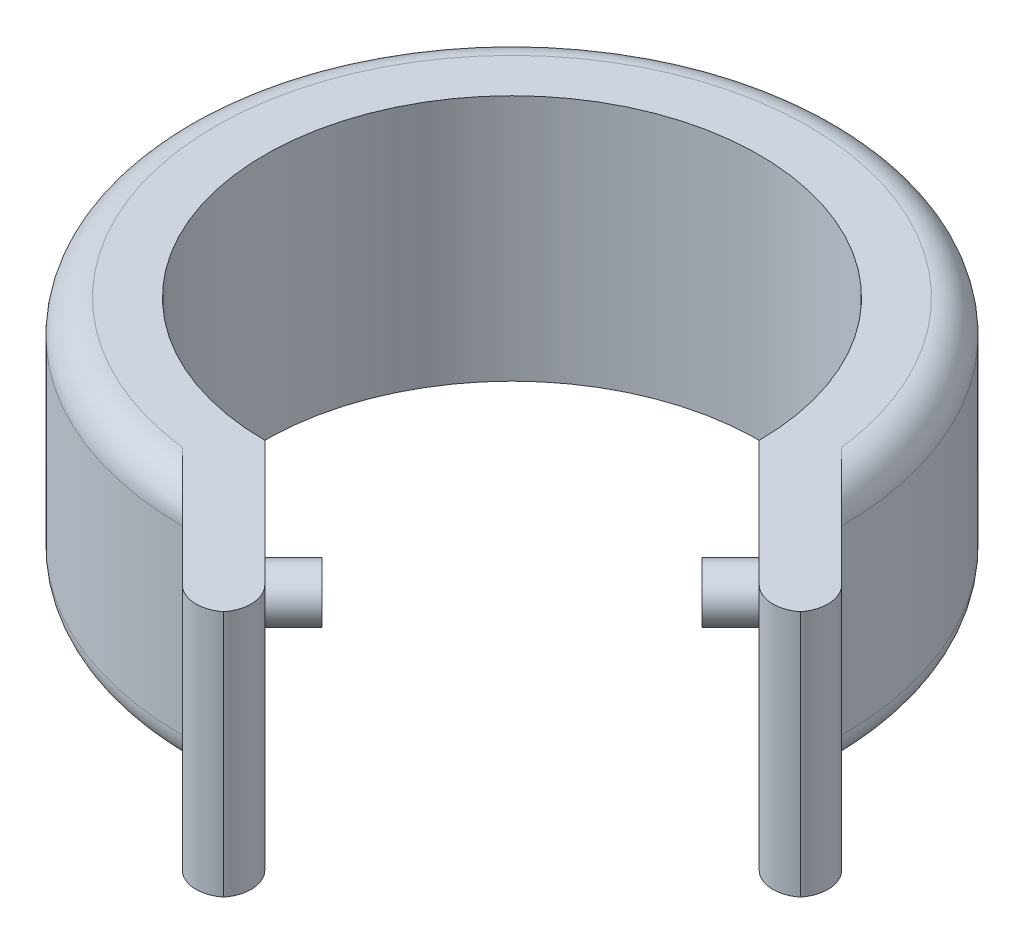
ISO-10303-21;
HEADER;
FILE_DESCRIPTION(('STEP AP214'),'2;1');
FILE_NAME('part.step','',(''),(''),'','','');
FILE_SCHEMA(('AUTOMOTIVE_DESIGN { 1 0 10303 214 1 1 1 1 }'));
ENDSEC;
DATA;
#1=APPLICATION_CONTEXT('core data for automotive mechanical design processes');
#2=APPLICATION_PROTOCOL_DEFINITION('international standard','automotive_design',2000,#1);
#3=PRODUCT_CONTEXT('',#1,'mechanical');
#4=PRODUCT('Part','Part','',(#3));
#5=PRODUCT_RELATED_PRODUCT_CATEGORY('part','',(#4));
#6=PRODUCT_DEFINITION_FORMATION('','',#4);
#7=PRODUCT_DEFINITION_CONTEXT('part definition',#1,'design');
#8=PRODUCT_DEFINITION('design','',#6,#7);
#9=PRODUCT_DEFINITION_SHAPE('','',#8);
#10=(LENGTH_UNIT() NAMED_UNIT(*) SI_UNIT(.MILLI.,.METRE.));
#11=(NAMED_UNIT(*) PLANE_ANGLE_UNIT() SI_UNIT($,.RADIAN.));
#12=(NAMED_UNIT(*) SI_UNIT($,.STERADIAN.) SOLID_ANGLE_UNIT());
#13=UNCERTAINTY_MEASURE_WITH_UNIT(LENGTH_MEASURE(1.E-05),#10,'distance_accuracy_value','');
#14=(GEOMETRIC_REPRESENTATION_CONTEXT(3) GLOBAL_UNCERTAINTY_ASSIGNED_CONTEXT((#13)) GLOBAL_UNIT_ASSIGNED_CONTEXT((#10,
#11,#12)) REPRESENTATION_CONTEXT('',''));
#15=CARTESIAN_POINT('',(0.,0.,0.));
#16=DIRECTION('',(0.,0.,1.));
#17=DIRECTION('',(1.,0.,0.));
#18=AXIS2_PLACEMENT_3D('',#15,#16,#17);
#19=CARTESIAN_POINT('',(0.,15.,0.));
#20=DIRECTION('',(0.,-1.,0.));
#21=DIRECTION('',(0.,0.,-1.));
#22=AXIS2_PLACEMENT_3D('',#19,#20,#21);
#23=CYLINDRICAL_SURFACE('',#22,15.);
#24=CARTESIAN_POINT('',(0.,0.,0.));
#25=DIRECTION('',(0.,-1.,0.));
#26=DIRECTION('',(0.,0.,1.));
#27=AXIS2_PLACEMENT_3D('',#24,#25,#26);
#28=CIRCLE('',#27,15.);
#29=CARTESIAN_POINT('',(0.,0.,15.));
#30=VERTEX_POINT('',#29);
#31=CARTESIAN_POINT('',(15.,0.,0.));
#32=VERTEX_POINT('',#31);
#33=EDGE_CURVE('E156',#30,#32,#28,.T.);
#34=ORIENTED_EDGE('',*,*,#33,.T.);
#35=DIRECTION('',(0.,-1.,0.));
#36=VECTOR('',#35,1.);
#37=CARTESIAN_POINT('',(15.,15.,0.));
#38=LINE('',#37,#36);
#39=CARTESIAN_POINT('',(15.,15.,0.));
#40=VERTEX_POINT('',#39);
#41=EDGE_CURVE('E136',#40,#32,#38,.T.);
#42=ORIENTED_EDGE('',*,*,#41,.F.);
#43=CARTESIAN_POINT('',(0.,15.,0.));
#44=DIRECTION('',(0.,-1.,0.));
#45=DIRECTION('',(0.,0.,1.));
#46=AXIS2_PLACEMENT_3D('',#43,#44,#45);
#47=CIRCLE('',#46,15.);
#48=CARTESIAN_POINT('',(0.,15.,15.));
#49=VERTEX_POINT('',#48);
#50=EDGE_CURVE('E145',#49,#40,#47,.T.);
#51=ORIENTED_EDGE('',*,*,#50,.F.);
#52=DIRECTION('',(0.,-1.,0.));
#53=VECTOR('',#52,1.);
#54=CARTESIAN_POINT('',(0.,15.,15.));
#55=LINE('',#54,#53);
#56=EDGE_CURVE('E276',#49,#30,#55,.T.);
#57=ORIENTED_EDGE('',*,*,#56,.T.);
#58=EDGE_LOOP('',(#34,#42,#51,#57));
#59=FACE_BOUND('',#58,.T.);
#60=ADVANCED_FACE('F39',(#59),#23,.F.);
#61=CARTESIAN_POINT('',(15.,15.,0.));
#62=DIRECTION('',(0.707106781186539,0.,-0.707106781186556));
#63=DIRECTION('',(-0.707106781186556,0.,-0.707106781186539));
#64=AXIS2_PLACEMENT_3D('',#61,#62,#63);
#65=PLANE('',#64);
#66=CARTESIAN_POINT('',(17.5000000000001,9.5,2.5));
#67=DIRECTION('',(0.707106781186539,0.,-0.707106781186556));
#68=DIRECTION('',(-0.707106781186556,0.,-0.707106781186539));
#69=AXIS2_PLACEMENT_3D('',#66,#67,#68);
#70=CIRCLE('',#69,1.5);
#71=CARTESIAN_POINT('',(16.4393398282202,9.5,1.43933982822019));
#72=VERTEX_POINT('',#71);
#73=EDGE_CURVE('E290',#72,#72,#70,.T.);
#74=ORIENTED_EDGE('',*,*,#73,.T.);
#75=EDGE_LOOP('',(#74));
#76=FACE_BOUND('',#75,.T.);
#77=DIRECTION('',(0.707106781186556,0.,0.707106781186539));
#78=VECTOR('',#77,1.);
#79=CARTESIAN_POINT('',(15.,0.,0.));
#80=LINE('',#79,#78);
#81=CARTESIAN_POINT('',(22.6040848940877,0.,7.60408489408751));
#82=VERTEX_POINT('',#81);
#83=EDGE_CURVE('E286',#32,#82,#80,.T.);
#84=ORIENTED_EDGE('',*,*,#83,.T.);
#85=DIRECTION('',(0.,-1.,0.));
#86=VECTOR('',#85,1.);
#87=CARTESIAN_POINT('',(22.6040848940877,15.,7.60408489408751));
#88=LINE('',#87,#86);
#89=CARTESIAN_POINT('',(22.6040848940877,15.,7.60408489408751));
#90=VERTEX_POINT('',#89);
#91=EDGE_CURVE('E137',#82,#90,#88,.F.);
#92=ORIENTED_EDGE('',*,*,#91,.T.);
#93=DIRECTION('',(0.707106781186556,0.,0.707106781186539));
#94=VECTOR('',#93,1.);
#95=CARTESIAN_POINT('',(15.,15.,0.));
#96=LINE('',#95,#94);
#97=EDGE_CURVE('E134',#40,#90,#96,.T.);
#98=ORIENTED_EDGE('',*,*,#97,.F.);
#99=ORIENTED_EDGE('',*,*,#41,.T.);
#100=EDGE_LOOP('',(#84,#92,#98,#99));
#101=FACE_BOUND('',#100,.T.);
#102=ADVANCED_FACE('F133',(#76,#101),#65,.F.);
#103=CARTESIAN_POINT('',(20.,15.,0.));
#104=DIRECTION('',(-0.707106781186539,0.,0.707106781186556));
#105=DIRECTION('',(0.707106781186556,0.,0.707106781186539));
#106=AXIS2_PLACEMENT_3D('',#103,#104,#105);
#107=PLANE('',#106);
#108=DIRECTION('',(-0.707106781186556,0.,-0.707106781186539));
#109=VECTOR('',#108,1.);
#110=CARTESIAN_POINT('',(20.,15.,0.));
#111=LINE('',#110,#109);
#112=CARTESIAN_POINT('',(25.1040848940876,15.,5.1040848940875));
#113=VERTEX_POINT('',#112);
#114=CARTESIAN_POINT('',(17.8740078740118,15.,-2.12599212598813));
#115=VERTEX_POINT('',#114);
#116=EDGE_CURVE('E141',#113,#115,#111,.T.);
#117=ORIENTED_EDGE('',*,*,#116,.F.);
#118=DIRECTION('',(0.,-1.,0.));
#119=VECTOR('',#118,1.);
#120=CARTESIAN_POINT('',(25.1040848940876,15.,5.1040848940875));
#121=LINE('',#120,#119);
#122=CARTESIAN_POINT('',(25.1040848940876,0.,5.1040848940875));
#123=VERTEX_POINT('',#122);
#124=EDGE_CURVE('E160',#113,#123,#121,.T.);
#125=ORIENTED_EDGE('',*,*,#124,.T.);
#126=DIRECTION('',(-0.707106781186556,0.,-0.707106781186539));
#127=VECTOR('',#126,1.);
#128=CARTESIAN_POINT('',(20.,0.,0.));
#129=LINE('',#128,#127);
#130=CARTESIAN_POINT('',(17.8740078740118,0.,-2.12599212598813));
#131=VERTEX_POINT('',#130);
#132=EDGE_CURVE('E287',#123,#131,#129,.T.);
#133=ORIENTED_EDGE('',*,*,#132,.T.);
#134=CARTESIAN_POINT('',(17.8740078740118,0.,-2.12599212598813));
#135=CARTESIAN_POINT('',(17.9665042094205,3.59778672668724E-05,-2.03349579057941));
#136=CARTESIAN_POINT('',(18.059057448076,0.00491623328392362,-1.94094255192396));
#137=CARTESIAN_POINT('',(18.2439111749515,0.0253001654740921,-1.75608882504841));
#138=CARTESIAN_POINT('',(18.3362094742657,0.0408429314317287,-1.6637905257343));
#139=CARTESIAN_POINT('',(18.5207613201583,0.0837947372328732,-1.47923867984171));
#140=CARTESIAN_POINT('',(18.6129966100676,0.111364844097097,-1.38700338993234));
#141=CARTESIAN_POINT('',(18.794893000941,0.179561850402837,-1.20510699905892));
#142=CARTESIAN_POINT('',(18.8845582149985,0.220166453069939,-1.11544178500143));
#143=CARTESIAN_POINT('',(19.063480300214,0.317738795220224,-0.936519699785961));
#144=CARTESIAN_POINT('',(19.1525809372503,0.375289884091958,-0.847419062749707));
#145=CARTESIAN_POINT('',(19.3239049032132,0.507536155529974,-0.676095096786825));
#146=CARTESIAN_POINT('',(19.406153064279,0.582165402087683,-0.59384693572097));
#147=CARTESIAN_POINT('',(19.5460081947274,0.734214755203873,-0.453991805272628));
#148=CARTESIAN_POINT('',(19.6053354192818,0.808446645538199,-0.3946645807182));
#149=CARTESIAN_POINT('',(19.7148338664651,0.969522969704174,-0.285166133534852));
#150=CARTESIAN_POINT('',(19.7650122880062,1.0563573895102,-0.234987711993797));
#151=CARTESIAN_POINT('',(19.8439226966136,1.22256582893553,-0.156077303386401));
#152=CARTESIAN_POINT('',(19.8749440828448,1.29975985858952,-0.125055917155182));
#153=CARTESIAN_POINT('',(19.9275251191116,1.4602803437447,-0.0724748808883702));
#154=CARTESIAN_POINT('',(19.9491042630809,1.54359374596723,-0.0508957369191398));
#155=CARTESIAN_POINT('',(19.9766642998299,1.68930339886969,-0.0233357001700908));
#156=CARTESIAN_POINT('',(19.9853616263582,1.7506882877381,-0.0146383736417696));
#157=CARTESIAN_POINT('',(19.9970535983199,1.87469406631603,-0.00294640168009994));
#158=CARTESIAN_POINT('',(20.0000331453418,1.93731778849743,3.31453418272428E-05));
#159=CARTESIAN_POINT('',(20.,2.,0.));
#160=B_SPLINE_CURVE_WITH_KNOTS('',3,(#134,#135,#136,#137,#138,#139,#140,#141,#142,#143,#144,
#145,#146,#147,#148,#149,#150,#151,#152,#153,#154,#155,#156,#157,#158,#159),.UNSPECIFIED.,.F.,
.F.,(4,2,2,2,2,2,2,2,2,2,2,2,4),(0.,0.392460687617547,0.786367894847758,1.18572040364713,
1.58439338914307,1.99882483237287,2.41168243994623,2.74657774193708,3.08120837698156,
3.34652908467836,3.61129941117597,3.79860875168884,3.98641202570013),.UNSPECIFIED.);
#161=CARTESIAN_POINT('',(20.,2.,0.));
#162=VERTEX_POINT('',#161);
#163=EDGE_CURVE('E11',#131,#162,#160,.T.);
#164=ORIENTED_EDGE('',*,*,#163,.T.);
#165=DIRECTION('',(0.,-1.,0.));
#166=VECTOR('',#165,1.);
#167=CARTESIAN_POINT('',(20.,15.,0.));
#168=LINE('',#167,#166);
#169=CARTESIAN_POINT('',(20.,13.,0.));
#170=VERTEX_POINT('',#169);
#171=EDGE_CURVE('E158',#170,#162,#168,.T.);
#172=ORIENTED_EDGE('',*,*,#171,.F.);
#173=CARTESIAN_POINT('',(20.,13.,0.));
#174=CARTESIAN_POINT('',(20.0000101879487,13.0444536603805,1.01879487249055E-05));
#175=CARTESIAN_POINT('',(19.998518247589,13.0888996179299,-0.00148175241103394));
#176=CARTESIAN_POINT('',(19.9926084548755,13.1773705544571,-0.00739154512451381));
#177=CARTESIAN_POINT('',(19.9881926473897,13.221395805851,-0.0118073526102953));
#178=CARTESIAN_POINT('',(19.9765595206408,13.3083372190693,-0.0234404793591624));
#179=CARTESIAN_POINT('',(19.9693646690365,13.3512594037243,-0.0306353309635175));
#180=CARTESIAN_POINT('',(19.9523160347569,13.4360257366673,-0.0476839652431169));
#181=CARTESIAN_POINT('',(19.9424619257781,13.4778697519681,-0.0575380742219497));
#182=CARTESIAN_POINT('',(19.9092128897343,13.6011397279345,-0.0907871102656604));
#183=CARTESIAN_POINT('',(19.8820889815048,13.6806073019471,-0.117911018495239));
#184=CARTESIAN_POINT('',(19.8194769472254,13.832701959266,-0.180523052774607));
#185=CARTESIAN_POINT('',(19.7839713913876,13.905314340527,-0.216028608612381));
#186=CARTESIAN_POINT('',(19.6913036381617,14.0693089489058,-0.308696361838281));
#187=CARTESIAN_POINT('',(19.6310580497141,14.1572098212282,-0.368941950285932));
#188=CARTESIAN_POINT('',(19.5014109110371,14.3181302534792,-0.498589088962855));
#189=CARTESIAN_POINT('',(19.4319958336202,14.3911274137992,-0.568004166379746));
#190=CARTESIAN_POINT('',(19.2560031464693,14.5510394796666,-0.743996853530659));
#191=CARTESIAN_POINT('',(19.1461540512435,14.630718529778,-0.853845948756463));
#192=CARTESIAN_POINT('',(18.918799956638,14.7649483311928,-1.08120004336193));
#193=CARTESIAN_POINT('',(18.8012672973553,14.8194018643229,-1.19873270264464));
#194=CARTESIAN_POINT('',(18.6155760484908,14.8867023350094,-1.38442395150919));
#195=CARTESIAN_POINT('',(18.5487444315512,14.9072780558842,-1.4512555684488));
#196=CARTESIAN_POINT('',(18.4142281058945,14.9420437937774,-1.58577189410544));
#197=CARTESIAN_POINT('',(18.3465431401449,14.9562318371589,-1.65345685985509));
#198=CARTESIAN_POINT('',(18.2114569593963,14.9784936127261,-1.78854304060365));
#199=CARTESIAN_POINT('',(18.1440611393239,14.9866344321579,-1.85593886067601));
#200=CARTESIAN_POINT('',(18.0091084638622,14.9973800003755,-1.99089153613778));
#201=CARTESIAN_POINT('',(17.941551811083,14.9999897852573,-2.05844818891692));
#202=CARTESIAN_POINT('',(17.8740078740118,15.,-2.12599212598813));
#203=B_SPLINE_CURVE_WITH_KNOTS('',3,(#173,#174,#175,#176,#177,#178,#179,#180,#181,#182,#183,
#184,#185,#186,#187,#188,#189,#190,#191,#192,#193,#194,#195,#196,#197,#198,#199,#200,#201,#202),
.UNSPECIFIED.,.F.,.F.,(4,2,2,2,2,2,2,2,2,2,2,2,2,2,4),(0.,0.133298362105438,0.266503597527682,
0.398653722338659,0.530820069980358,0.794236738099804,1.0582060878397,1.42341000224754,
1.78915882543645,2.3100906110991,2.83301367915987,3.12300868508574,3.41309323102865,
3.69990947413696,3.98646445404201),.UNSPECIFIED.);
#204=EDGE_CURVE('E209',#170,#115,#203,.T.);
#205=ORIENTED_EDGE('',*,*,#204,.T.);
#206=EDGE_LOOP('',(#117,#125,#133,#164,#172,#205));
#207=FACE_BOUND('',#206,.T.);
#208=ADVANCED_FACE('F246',(#207),#107,.F.);
#209=CARTESIAN_POINT('',(0.,15.,0.));
#210=DIRECTION('',(0.,-1.,0.));
#211=DIRECTION('',(0.,0.,-1.));
#212=AXIS2_PLACEMENT_3D('',#209,#210,#211);
#213=CYLINDRICAL_SURFACE('',#212,20.);
#214=DIRECTION('',(0.,-1.,0.));
#215=VECTOR('',#214,1.);
#216=CARTESIAN_POINT('',(0.,15.,20.));
#217=LINE('',#216,#215);
#218=CARTESIAN_POINT('',(0.,13.,20.));
#219=VERTEX_POINT('',#218);
#220=CARTESIAN_POINT('',(0.,2.,20.));
#221=VERTEX_POINT('',#220);
#222=EDGE_CURVE('E163',#219,#221,#217,.T.);
#223=ORIENTED_EDGE('',*,*,#222,.F.);
#224=CARTESIAN_POINT('',(0.,13.,0.));
#225=DIRECTION('',(0.,1.,0.));
#226=DIRECTION('',(0.,0.,1.));
#227=AXIS2_PLACEMENT_3D('',#224,#225,#226);
#228=CIRCLE('',#227,20.);
#229=EDGE_CURVE('E205',#219,#170,#228,.F.);
#230=ORIENTED_EDGE('',*,*,#229,.T.);
#231=ORIENTED_EDGE('',*,*,#171,.T.);
#232=CARTESIAN_POINT('',(0.,2.,0.));
#233=DIRECTION('',(0.,1.,0.));
#234=DIRECTION('',(0.,0.,1.));
#235=AXIS2_PLACEMENT_3D('',#232,#233,#234);
#236=CIRCLE('',#235,20.);
#237=EDGE_CURVE('E199',#162,#221,#236,.T.);
#238=ORIENTED_EDGE('',*,*,#237,.T.);
#239=EDGE_LOOP('',(#223,#230,#231,#238));
#240=FACE_BOUND('',#239,.T.);
#241=ADVANCED_FACE('F253',(#240),#213,.T.);
#242=CARTESIAN_POINT('',(0.,15.,20.));
#243=DIRECTION('',(0.707106781186539,0.,-0.707106781186556));
#244=DIRECTION('',(-0.707106781186556,0.,-0.707106781186539));
#245=AXIS2_PLACEMENT_3D('',#242,#243,#244);
#246=PLANE('',#245);
#247=DIRECTION('',(0.707106781186556,0.,0.707106781186539));
#248=VECTOR('',#247,1.);
#249=CARTESIAN_POINT('',(0.,0.,20.));
#250=LINE('',#249,#248);
#251=CARTESIAN_POINT('',(-2.12599212598825,0.,17.8740078740118));
#252=VERTEX_POINT('',#251);
#253=CARTESIAN_POINT('',(5.10408489408788,0.,25.1040848940878));
#254=VERTEX_POINT('',#253);
#255=EDGE_CURVE('E295',#252,#254,#250,.T.);
#256=ORIENTED_EDGE('',*,*,#255,.T.);
#257=DIRECTION('',(0.,-1.,0.));
#258=VECTOR('',#257,1.);
#259=CARTESIAN_POINT('',(5.10408489408788,15.,25.1040848940878));
#260=LINE('',#259,#258);
#261=CARTESIAN_POINT('',(5.10408489408788,15.,25.1040848940878));
#262=VERTEX_POINT('',#261);
#263=EDGE_CURVE('E193',#254,#262,#260,.F.);
#264=ORIENTED_EDGE('',*,*,#263,.T.);
#265=DIRECTION('',(0.707106781186556,0.,0.707106781186539));
#266=VECTOR('',#265,1.);
#267=CARTESIAN_POINT('',(0.,15.,20.));
#268=LINE('',#267,#266);
#269=CARTESIAN_POINT('',(-2.12599212598825,15.,17.8740078740118));
#270=VERTEX_POINT('',#269);
#271=EDGE_CURVE('E278',#270,#262,#268,.T.);
#272=ORIENTED_EDGE('',*,*,#271,.F.);
#273=CARTESIAN_POINT('',(-2.12599212598825,15.,17.8740078740118));
#274=CARTESIAN_POINT('',(-2.03349579057952,14.9999640221327,17.9665042094205));
#275=CARTESIAN_POINT('',(-1.94094255192407,14.9950837667161,18.059057448076));
#276=CARTESIAN_POINT('',(-1.7560888250485,14.9746998345259,18.2439111749515));
#277=CARTESIAN_POINT('',(-1.66379052573437,14.9591570685683,18.3362094742657));
#278=CARTESIAN_POINT('',(-1.47923867984177,14.9162052627671,18.5207613201583));
#279=CARTESIAN_POINT('',(-1.38700338993239,14.8886351559029,18.6129966100676));
#280=CARTESIAN_POINT('',(-1.20510699905895,14.8204381495972,18.7948930009411));
#281=CARTESIAN_POINT('',(-1.11544178500145,14.77983354693,18.8845582149986));
#282=CARTESIAN_POINT('',(-0.936519699785972,14.6822612047798,19.0634803002141));
#283=CARTESIAN_POINT('',(-0.847419062749717,14.624710115908,19.1525809372503));
#284=CARTESIAN_POINT('',(-0.676095096786834,14.49246384447,19.3239049032132));
#285=CARTESIAN_POINT('',(-0.593846935720978,14.4178345979123,19.406153064279));
#286=CARTESIAN_POINT('',(-0.453991805272633,14.2657852447961,19.5460081947274));
#287=CARTESIAN_POINT('',(-0.394664580718204,14.1915533544618,19.6053354192818));
#288=CARTESIAN_POINT('',(-0.285166133534855,14.0304770302958,19.7148338664651));
#289=CARTESIAN_POINT('',(-0.234987711993801,13.9436426104898,19.7650122880062));
#290=CARTESIAN_POINT('',(-0.156077303386404,13.7774341710644,19.8439226966136));
#291=CARTESIAN_POINT('',(-0.125055917155183,13.7002401414105,19.8749440828448));
#292=CARTESIAN_POINT('',(-0.0724748808883702,13.5397196562553,19.9275251191116));
#293=CARTESIAN_POINT('',(-0.0508957369191402,13.4564062540328,19.9491042630809));
#294=CARTESIAN_POINT('',(-0.0233357001700913,13.3106966011303,19.9766642998299));
#295=CARTESIAN_POINT('',(-0.0146383736417702,13.2493117122619,19.9853616263582));
#296=CARTESIAN_POINT('',(-0.00294640168010018,13.125305933684,19.9970535983199));
#297=CARTESIAN_POINT('',(3.31453418271642E-05,13.0626822115026,20.0000331453418));
#298=CARTESIAN_POINT('',(0.,13.,20.));
#299=B_SPLINE_CURVE_WITH_KNOTS('',3,(#273,#274,#275,#276,#277,#278,#279,#280,#281,#282,#283,
#284,#285,#286,#287,#288,#289,#290,#291,#292,#293,#294,#295,#296,#297,#298),.UNSPECIFIED.,.F.,
.F.,(4,2,2,2,2,2,2,2,2,2,2,2,4),(0.,0.392460687617575,0.786367894847812,1.18572040364722,
1.58439338914319,1.99882483237298,2.41168243994633,2.74657774193719,3.08120837698166,
3.34652908467846,3.61129941117606,3.79860875168892,3.98641202570021),.UNSPECIFIED.);
#300=EDGE_CURVE('E61',#270,#219,#299,.T.);
#301=ORIENTED_EDGE('',*,*,#300,.T.);
#302=ORIENTED_EDGE('',*,*,#222,.T.);
#303=CARTESIAN_POINT('',(0.,2.,20.));
#304=CARTESIAN_POINT('',(1.0187948724608E-05,1.95554633961955,20.0000101879487));
#305=CARTESIAN_POINT('',(-0.00148175241103423,1.9111003820701,19.998518247589));
#306=CARTESIAN_POINT('',(-0.00739154512451394,1.82262944554287,19.9926084548755));
#307=CARTESIAN_POINT('',(-0.0118073526102953,1.77860419414898,19.9881926473897));
#308=CARTESIAN_POINT('',(-0.0234404793591625,1.69166278093071,19.9765595206408));
#309=CARTESIAN_POINT('',(-0.0306353309635179,1.64874059627569,19.9693646690365));
#310=CARTESIAN_POINT('',(-0.0476839652431178,1.56397426333266,19.9523160347569));
#311=CARTESIAN_POINT('',(-0.0575380742219509,1.52213024803192,19.9424619257781));
#312=CARTESIAN_POINT('',(-0.0907871102656615,1.39886027206553,19.9092128897343));
#313=CARTESIAN_POINT('',(-0.117911018495239,1.31939269805289,19.8820889815048));
#314=CARTESIAN_POINT('',(-0.180523052774608,1.16729804073398,19.8194769472254));
#315=CARTESIAN_POINT('',(-0.216028608612384,1.094685659473,19.7839713913876));
#316=CARTESIAN_POINT('',(-0.308696361838287,0.930691051094174,19.6913036381617));
#317=CARTESIAN_POINT('',(-0.36894195028594,0.842790178771811,19.6310580497141));
#318=CARTESIAN_POINT('',(-0.498589088962865,0.681869746520788,19.5014109110371));
#319=CARTESIAN_POINT('',(-0.568004166379758,0.608872586200798,19.4319958336203));
#320=CARTESIAN_POINT('',(-0.74399685353068,0.44896052033346,19.2560031464693));
#321=CARTESIAN_POINT('',(-0.85384594875649,0.369281470221983,19.1461540512435));
#322=CARTESIAN_POINT('',(-1.08120004336197,0.235051668807172,18.9187999566381));
#323=CARTESIAN_POINT('',(-1.19873270264468,0.180598135677087,18.8012672973553));
#324=CARTESIAN_POINT('',(-1.38442395150925,0.113297664990647,18.6155760484908));
#325=CARTESIAN_POINT('',(-1.45125556844886,0.09272194411584,18.5487444315512));
#326=CARTESIAN_POINT('',(-1.58577189410551,0.0579562062225623,18.4142281058945));
#327=CARTESIAN_POINT('',(-1.65345685985517,0.0437681628411261,18.3465431401449));
#328=CARTESIAN_POINT('',(-1.78854304060374,0.0215063872738956,18.2114569593963));
#329=CARTESIAN_POINT('',(-1.85593886067611,0.0133655678420694,18.1440611393239));
#330=CARTESIAN_POINT('',(-1.99089153613789,0.002619999624475,18.0091084638622));
#331=CARTESIAN_POINT('',(-2.05844818891703,1.0214742676303E-05,17.941551811083));
#332=CARTESIAN_POINT('',(-2.12599212598825,0.,17.8740078740118));
#333=B_SPLINE_CURVE_WITH_KNOTS('',3,(#303,#304,#305,#306,#307,#308,#309,#310,#311,#312,#313,
#314,#315,#316,#317,#318,#319,#320,#321,#322,#323,#324,#325,#326,#327,#328,#329,#330,#331,#332),
.UNSPECIFIED.,.F.,.F.,(4,2,2,2,2,2,2,2,2,2,2,2,2,2,4),(0.,0.133298362105435,0.266503597527676,
0.398653722338652,0.53082006998035,0.794236738099793,1.05820608783968,1.42341000224752,
1.78915882543644,2.3100906110991,2.83301367915988,3.12300868508578,3.4130932310287,
3.69990947413702,3.98646445404209),.UNSPECIFIED.);
#334=EDGE_CURVE('E47',#221,#252,#333,.T.);
#335=ORIENTED_EDGE('',*,*,#334,.T.);
#336=EDGE_LOOP('',(#256,#264,#272,#301,#302,#335));
#337=FACE_BOUND('',#336,.T.);
#338=ADVANCED_FACE('F220',(#337),#246,.F.);
#339=CARTESIAN_POINT('',(0.,15.,15.));
#340=DIRECTION('',(-0.707106781186539,0.,0.707106781186556));
#341=DIRECTION('',(0.707106781186556,0.,0.707106781186539));
#342=AXIS2_PLACEMENT_3D('',#339,#340,#341);
#343=PLANE('',#342);
#344=CARTESIAN_POINT('',(2.50000000000024,9.5,17.5000000000002));
#345=DIRECTION('',(-0.707106781186539,0.,0.707106781186556));
#346=DIRECTION('',(0.707106781186556,0.,0.707106781186539));
#347=AXIS2_PLACEMENT_3D('',#344,#345,#346);
#348=CIRCLE('',#347,1.5);
#349=CARTESIAN_POINT('',(3.56066017178008,9.5,18.56066017178));
#350=VERTEX_POINT('',#349);
#351=EDGE_CURVE('E169',#350,#350,#348,.T.);
#352=ORIENTED_EDGE('',*,*,#351,.T.);
#353=EDGE_LOOP('',(#352));
#354=FACE_BOUND('',#353,.T.);
#355=DIRECTION('',(-0.707106781186556,0.,-0.707106781186539));
#356=VECTOR('',#355,1.);
#357=CARTESIAN_POINT('',(0.,15.,15.));
#358=LINE('',#357,#356);
#359=CARTESIAN_POINT('',(7.60408489408788,15.,22.6040848940877));
#360=VERTEX_POINT('',#359);
#361=EDGE_CURVE('E149',#360,#49,#358,.T.);
#362=ORIENTED_EDGE('',*,*,#361,.F.);
#363=DIRECTION('',(0.,-1.,0.));
#364=VECTOR('',#363,1.);
#365=CARTESIAN_POINT('',(7.60408489408788,15.,22.6040848940877));
#366=LINE('',#365,#364);
#367=CARTESIAN_POINT('',(7.60408489408788,0.,22.6040848940877));
#368=VERTEX_POINT('',#367);
#369=EDGE_CURVE('E196',#360,#368,#366,.T.);
#370=ORIENTED_EDGE('',*,*,#369,.T.);
#371=DIRECTION('',(-0.707106781186556,0.,-0.707106781186539));
#372=VECTOR('',#371,1.);
#373=CARTESIAN_POINT('',(0.,0.,15.));
#374=LINE('',#373,#372);
#375=EDGE_CURVE('E153',#368,#30,#374,.T.);
#376=ORIENTED_EDGE('',*,*,#375,.T.);
#377=ORIENTED_EDGE('',*,*,#56,.F.);
#378=EDGE_LOOP('',(#362,#370,#376,#377));
#379=FACE_BOUND('',#378,.T.);
#380=ADVANCED_FACE('F280',(#354,#379),#343,.F.);
#381=CARTESIAN_POINT('',(0.,15.,0.));
#382=DIRECTION('',(0.,1.,0.));
#383=DIRECTION('',(0.,0.,1.));
#384=AXIS2_PLACEMENT_3D('',#381,#382,#383);
#385=PLANE('',#384);
#386=CARTESIAN_POINT('',(24.0182984564608,15.,6.18987133171439));
#387=DIRECTION('',(0.,1.,0.));
#388=DIRECTION('',(0.,0.,1.));
#389=AXIS2_PLACEMENT_3D('',#386,#387,#388);
#390=CIRCLE('',#389,2.);
#391=CARTESIAN_POINT('',(25.2587321472914,15.,7.7587321472912));
#392=VERTEX_POINT('',#391);
#393=EDGE_CURVE('E188',#90,#392,#390,.T.);
#394=ORIENTED_EDGE('',*,*,#393,.T.);
#395=CARTESIAN_POINT('',(23.6898713317146,15.,6.51829845646062));
#396=DIRECTION('',(0.,1.,0.));
#397=DIRECTION('',(0.,0.,1.));
#398=AXIS2_PLACEMENT_3D('',#395,#396,#397);
#399=CIRCLE('',#398,2.);
#400=EDGE_CURVE('E191',#392,#113,#399,.T.);
#401=ORIENTED_EDGE('',*,*,#400,.T.);
#402=ORIENTED_EDGE('',*,*,#116,.T.);
#403=CARTESIAN_POINT('',(0.,15.,0.));
#404=DIRECTION('',(0.,1.,0.));
#405=DIRECTION('',(0.,0.,1.));
#406=AXIS2_PLACEMENT_3D('',#403,#404,#405);
#407=CIRCLE('',#406,18.);
#408=EDGE_CURVE('E181',#115,#270,#407,.T.);
#409=ORIENTED_EDGE('',*,*,#408,.T.);
#410=ORIENTED_EDGE('',*,*,#271,.T.);
#411=CARTESIAN_POINT('',(6.51829845646096,15.,23.6898713317146));
#412=DIRECTION('',(0.,1.,0.));
#413=DIRECTION('',(0.,0.,1.));
#414=AXIS2_PLACEMENT_3D('',#411,#412,#413);
#415=CIRCLE('',#414,2.);
#416=CARTESIAN_POINT('',(7.75873214729161,15.,25.2587321472914));
#417=VERTEX_POINT('',#416);
#418=EDGE_CURVE('E190',#262,#417,#415,.T.);
#419=ORIENTED_EDGE('',*,*,#418,.T.);
#420=CARTESIAN_POINT('',(6.1898713317148,15.,24.0182984564608));
#421=DIRECTION('',(0.,1.,0.));
#422=DIRECTION('',(0.,0.,1.));
#423=AXIS2_PLACEMENT_3D('',#420,#421,#422);
#424=CIRCLE('',#423,2.);
#425=EDGE_CURVE('E187',#417,#360,#424,.T.);
#426=ORIENTED_EDGE('',*,*,#425,.T.);
#427=ORIENTED_EDGE('',*,*,#361,.T.);
#428=ORIENTED_EDGE('',*,*,#50,.T.);
#429=ORIENTED_EDGE('',*,*,#97,.T.);
#430=EDGE_LOOP('',(#394,#401,#402,#409,#410,#419,#426,#427,#428,#429));
#431=FACE_BOUND('',#430,.T.);
#432=ADVANCED_FACE('F150',(#431),#385,.T.);
#433=CARTESIAN_POINT('',(0.,0.,0.));
#434=DIRECTION('',(0.,1.,0.));
#435=DIRECTION('',(0.,0.,1.));
#436=AXIS2_PLACEMENT_3D('',#433,#434,#435);
#437=PLANE('',#436);
#438=ORIENTED_EDGE('',*,*,#132,.F.);
#439=CARTESIAN_POINT('',(23.6898713317146,0.,6.51829845646062));
#440=DIRECTION('',(0.,1.,0.));
#441=DIRECTION('',(0.,0.,1.));
#442=AXIS2_PLACEMENT_3D('',#439,#440,#441);
#443=CIRCLE('',#442,2.);
#444=CARTESIAN_POINT('',(25.2587321472914,0.,7.7587321472912));
#445=VERTEX_POINT('',#444);
#446=EDGE_CURVE('E182',#123,#445,#443,.F.);
#447=ORIENTED_EDGE('',*,*,#446,.T.);
#448=CARTESIAN_POINT('',(24.0182984564608,0.,6.18987133171439));
#449=DIRECTION('',(0.,1.,0.));
#450=DIRECTION('',(0.,0.,1.));
#451=AXIS2_PLACEMENT_3D('',#448,#449,#450);
#452=CIRCLE('',#451,2.);
#453=EDGE_CURVE('E178',#445,#82,#452,.F.);
#454=ORIENTED_EDGE('',*,*,#453,.T.);
#455=ORIENTED_EDGE('',*,*,#83,.F.);
#456=ORIENTED_EDGE('',*,*,#33,.F.);
#457=ORIENTED_EDGE('',*,*,#375,.F.);
#458=CARTESIAN_POINT('',(6.1898713317148,0.,24.0182984564608));
#459=DIRECTION('',(0.,1.,0.));
#460=DIRECTION('',(0.,0.,1.));
#461=AXIS2_PLACEMENT_3D('',#458,#459,#460);
#462=CIRCLE('',#461,2.);
#463=CARTESIAN_POINT('',(7.75873214729161,0.,25.2587321472914));
#464=VERTEX_POINT('',#463);
#465=EDGE_CURVE('E173',#368,#464,#462,.F.);
#466=ORIENTED_EDGE('',*,*,#465,.T.);
#467=CARTESIAN_POINT('',(6.51829845646096,0.,23.6898713317146));
#468=DIRECTION('',(0.,1.,0.));
#469=DIRECTION('',(0.,0.,1.));
#470=AXIS2_PLACEMENT_3D('',#467,#468,#469);
#471=CIRCLE('',#470,2.);
#472=EDGE_CURVE('E176',#464,#254,#471,.F.);
#473=ORIENTED_EDGE('',*,*,#472,.T.);
#474=ORIENTED_EDGE('',*,*,#255,.F.);
#475=CARTESIAN_POINT('',(0.,0.,0.));
#476=DIRECTION('',(0.,1.,0.));
#477=DIRECTION('',(0.,0.,1.));
#478=AXIS2_PLACEMENT_3D('',#475,#476,#477);
#479=CIRCLE('',#478,18.);
#480=EDGE_CURVE('E161',#252,#131,#479,.F.);
#481=ORIENTED_EDGE('',*,*,#480,.T.);
#482=EDGE_LOOP('',(#438,#447,#454,#455,#456,#457,#466,#473,#474,#481));
#483=FACE_BOUND('',#482,.T.);
#484=ADVANCED_FACE('F308',(#483),#437,.F.);
#485=CARTESIAN_POINT('',(15.7573593128808,9.5,4.24264068711934));
#486=DIRECTION('',(0.707106781186539,0.,-0.707106781186556));
#487=DIRECTION('',(-0.707106781186556,0.,-0.707106781186539));
#488=AXIS2_PLACEMENT_3D('',#485,#486,#487);
#489=CYLINDRICAL_SURFACE('',#488,1.5);
#490=CARTESIAN_POINT('',(15.7573593128808,9.5,4.24264068711934));
#491=DIRECTION('',(0.707106781186539,0.,-0.707106781186556));
#492=DIRECTION('',(-0.707106781186556,0.,-0.707106781186539));
#493=AXIS2_PLACEMENT_3D('',#490,#491,#492);
#494=CIRCLE('',#493,1.5);
#495=CARTESIAN_POINT('',(14.6966991411009,9.5,3.18198051533953));
#496=VERTEX_POINT('',#495);
#497=EDGE_CURVE('E168',#496,#496,#494,.T.);
#498=ORIENTED_EDGE('',*,*,#497,.T.);
#499=EDGE_LOOP('',(#498));
#500=FACE_BOUND('',#499,.T.);
#501=ORIENTED_EDGE('',*,*,#73,.F.);
#502=EDGE_LOOP('',(#501));
#503=FACE_BOUND('',#502,.T.);
#504=ADVANCED_FACE('F311',(#500,#503),#489,.T.);
#505=CARTESIAN_POINT('',(15.7573593128808,9.5,4.24264068711934));
#506=DIRECTION('',(0.707106781186539,0.,-0.707106781186556));
#507=DIRECTION('',(-0.707106781186556,0.,-0.707106781186539));
#508=AXIS2_PLACEMENT_3D('',#505,#506,#507);
#509=PLANE('',#508);
#510=ORIENTED_EDGE('',*,*,#497,.F.);
#511=EDGE_LOOP('',(#510));
#512=FACE_BOUND('',#511,.T.);
#513=ADVANCED_FACE('F316',(#512),#509,.F.);
#514=CARTESIAN_POINT('',(4.24264068711947,9.5,15.7573593128809));
#515=DIRECTION('',(-0.707106781186539,0.,0.707106781186556));
#516=DIRECTION('',(0.707106781186556,0.,0.707106781186539));
#517=AXIS2_PLACEMENT_3D('',#514,#515,#516);
#518=CYLINDRICAL_SURFACE('',#517,1.5);
#519=CARTESIAN_POINT('',(4.24264068711947,9.5,15.7573593128809));
#520=DIRECTION('',(-0.707106781186539,0.,0.707106781186556));
#521=DIRECTION('',(0.707106781186556,0.,0.707106781186539));
#522=AXIS2_PLACEMENT_3D('',#519,#520,#521);
#523=CIRCLE('',#522,1.5);
#524=CARTESIAN_POINT('',(5.30330085889931,9.5,16.8180194846607));
#525=VERTEX_POINT('',#524);
#526=EDGE_CURVE('E172',#525,#525,#523,.T.);
#527=ORIENTED_EDGE('',*,*,#526,.T.);
#528=EDGE_LOOP('',(#527));
#529=FACE_BOUND('',#528,.T.);
#530=ORIENTED_EDGE('',*,*,#351,.F.);
#531=EDGE_LOOP('',(#530));
#532=FACE_BOUND('',#531,.T.);
#533=ADVANCED_FACE('F318',(#529,#532),#518,.T.);
#534=CARTESIAN_POINT('',(4.24264068711947,9.5,15.7573593128809));
#535=DIRECTION('',(-0.707106781186539,0.,0.707106781186556));
#536=DIRECTION('',(0.707106781186556,0.,0.707106781186539));
#537=AXIS2_PLACEMENT_3D('',#534,#535,#536);
#538=PLANE('',#537);
#539=ORIENTED_EDGE('',*,*,#526,.F.);
#540=EDGE_LOOP('',(#539));
#541=FACE_BOUND('',#540,.T.);
#542=ADVANCED_FACE('F239',(#541),#538,.F.);
#543=CARTESIAN_POINT('',(24.0182984564608,15.,6.18987133171439));
#544=DIRECTION('',(0.,-1.,0.));
#545=DIRECTION('',(0.,0.,-1.));
#546=AXIS2_PLACEMENT_3D('',#543,#544,#545);
#547=CYLINDRICAL_SURFACE('',#546,2.);
#548=DIRECTION('',(0.,-1.,0.));
#549=VECTOR('',#548,1.);
#550=CARTESIAN_POINT('',(25.2587321472914,7.5,7.7587321472912));
#551=LINE('',#550,#549);
#552=EDGE_CURVE('E265',#392,#445,#551,.T.);
#553=ORIENTED_EDGE('',*,*,#552,.F.);
#554=ORIENTED_EDGE('',*,*,#393,.F.);
#555=ORIENTED_EDGE('',*,*,#91,.F.);
#556=ORIENTED_EDGE('',*,*,#453,.F.);
#557=EDGE_LOOP('',(#553,#554,#555,#556));
#558=FACE_BOUND('',#557,.T.);
#559=ADVANCED_FACE('F237',(#558),#547,.T.);
#560=CARTESIAN_POINT('',(23.6898713317146,15.,6.51829845646062));
#561=DIRECTION('',(0.,-1.,0.));
#562=DIRECTION('',(0.,0.,-1.));
#563=AXIS2_PLACEMENT_3D('',#560,#561,#562);
#564=CYLINDRICAL_SURFACE('',#563,2.);
#565=ORIENTED_EDGE('',*,*,#400,.F.);
#566=ORIENTED_EDGE('',*,*,#552,.T.);
#567=ORIENTED_EDGE('',*,*,#446,.F.);
#568=ORIENTED_EDGE('',*,*,#124,.F.);
#569=EDGE_LOOP('',(#565,#566,#567,#568));
#570=FACE_BOUND('',#569,.T.);
#571=ADVANCED_FACE('F234',(#570),#564,.T.);
#572=CARTESIAN_POINT('',(6.1898713317148,15.,24.0182984564608));
#573=DIRECTION('',(0.,-1.,0.));
#574=DIRECTION('',(0.,0.,-1.));
#575=AXIS2_PLACEMENT_3D('',#572,#573,#574);
#576=CYLINDRICAL_SURFACE('',#575,2.);
#577=ORIENTED_EDGE('',*,*,#369,.F.);
#578=ORIENTED_EDGE('',*,*,#425,.F.);
#579=DIRECTION('',(0.,-1.,0.));
#580=VECTOR('',#579,1.);
#581=CARTESIAN_POINT('',(7.75873214729162,7.5,25.2587321472914));
#582=LINE('',#581,#580);
#583=EDGE_CURVE('E42',#464,#417,#582,.F.);
#584=ORIENTED_EDGE('',*,*,#583,.F.);
#585=ORIENTED_EDGE('',*,*,#465,.F.);
#586=EDGE_LOOP('',(#577,#578,#584,#585));
#587=FACE_BOUND('',#586,.T.);
#588=ADVANCED_FACE('F229',(#587),#576,.T.);
#589=CARTESIAN_POINT('',(6.51829845646096,15.,23.6898713317146));
#590=DIRECTION('',(0.,-1.,0.));
#591=DIRECTION('',(0.,0.,-1.));
#592=AXIS2_PLACEMENT_3D('',#589,#590,#591);
#593=CYLINDRICAL_SURFACE('',#592,2.);
#594=ORIENTED_EDGE('',*,*,#418,.F.);
#595=ORIENTED_EDGE('',*,*,#263,.F.);
#596=ORIENTED_EDGE('',*,*,#472,.F.);
#597=ORIENTED_EDGE('',*,*,#583,.T.);
#598=EDGE_LOOP('',(#594,#595,#596,#597));
#599=FACE_BOUND('',#598,.T.);
#600=ADVANCED_FACE('F223',(#599),#593,.T.);
#601=CARTESIAN_POINT('',(0.,13.,0.));
#602=DIRECTION('',(0.,1.,0.));
#603=DIRECTION('',(0.,0.,1.));
#604=AXIS2_PLACEMENT_3D('',#601,#602,#603);
#605=TOROIDAL_SURFACE('',#604,18.,2.);
#606=ORIENTED_EDGE('',*,*,#204,.F.);
#607=ORIENTED_EDGE('',*,*,#229,.F.);
#608=ORIENTED_EDGE('',*,*,#300,.F.);
#609=ORIENTED_EDGE('',*,*,#408,.F.);
#610=EDGE_LOOP('',(#606,#607,#608,#609));
#611=FACE_BOUND('',#610,.T.);
#612=ADVANCED_FACE('F222',(#611),#605,.T.);
#613=CARTESIAN_POINT('',(0.,2.,0.));
#614=DIRECTION('',(0.,1.,0.));
#615=DIRECTION('',(0.,0.,1.));
#616=AXIS2_PLACEMENT_3D('',#613,#614,#615);
#617=TOROIDAL_SURFACE('',#616,18.,2.);
#618=ORIENTED_EDGE('',*,*,#163,.F.);
#619=ORIENTED_EDGE('',*,*,#480,.F.);
#620=ORIENTED_EDGE('',*,*,#334,.F.);
#621=ORIENTED_EDGE('',*,*,#237,.F.);
#622=EDGE_LOOP('',(#618,#619,#620,#621));
#623=FACE_BOUND('',#622,.T.);
#624=ADVANCED_FACE('F41',(#623),#617,.T.);
#625=CLOSED_SHELL('',(#60,#102,#208,#241,#338,#380,#432,#484,#504,#513,#533,#542,#559,#571,#588,
#600,#612,#624));
#626=MANIFOLD_SOLID_BREP('B2',#625);
#627=ADVANCED_BREP_SHAPE_REPRESENTATION('',(#18,#626),#14);
#628=SHAPE_DEFINITION_REPRESENTATION(#9,#627);
ENDSEC;
END-ISO-10303-21;
